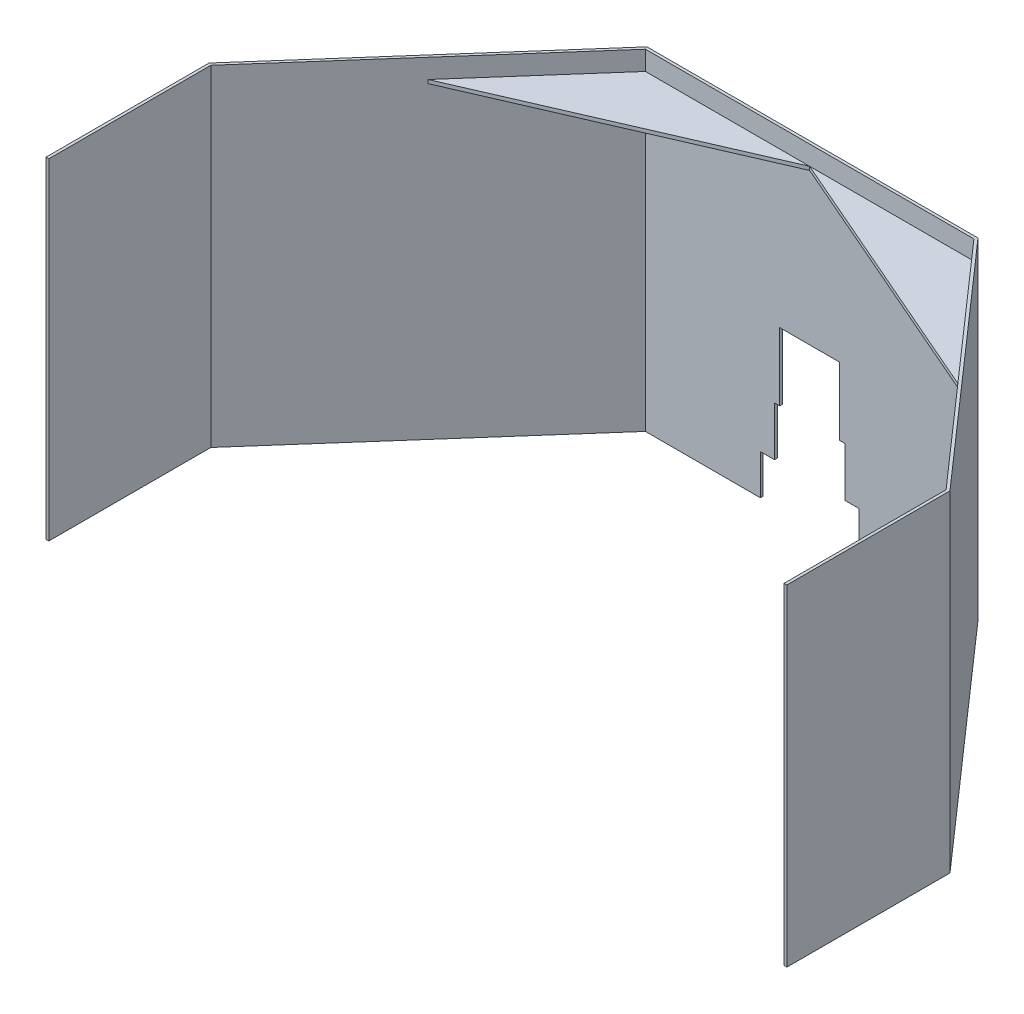
ISO-10303-21;
HEADER;
FILE_DESCRIPTION(('STEP AP214'),'2;1');
FILE_NAME('part.step','',(''),(''),'','','');
FILE_SCHEMA(('AUTOMOTIVE_DESIGN { 1 0 10303 214 1 1 1 1 }'));
ENDSEC;
DATA;
#1=APPLICATION_CONTEXT('core data for automotive mechanical design processes');
#2=APPLICATION_PROTOCOL_DEFINITION('international standard','automotive_design',2000,#1);
#3=PRODUCT_CONTEXT('',#1,'mechanical');
#4=PRODUCT('Part','Part','',(#3));
#5=PRODUCT_RELATED_PRODUCT_CATEGORY('part','',(#4));
#6=PRODUCT_DEFINITION_FORMATION('','',#4);
#7=PRODUCT_DEFINITION_CONTEXT('part definition',#1,'design');
#8=PRODUCT_DEFINITION('design','',#6,#7);
#9=PRODUCT_DEFINITION_SHAPE('','',#8);
#10=(LENGTH_UNIT() NAMED_UNIT(*) SI_UNIT(.MILLI.,.METRE.));
#11=(NAMED_UNIT(*) PLANE_ANGLE_UNIT() SI_UNIT($,.RADIAN.));
#12=(NAMED_UNIT(*) SI_UNIT($,.STERADIAN.) SOLID_ANGLE_UNIT());
#13=UNCERTAINTY_MEASURE_WITH_UNIT(LENGTH_MEASURE(1.E-05),#10,'distance_accuracy_value','');
#14=(GEOMETRIC_REPRESENTATION_CONTEXT(3) GLOBAL_UNCERTAINTY_ASSIGNED_CONTEXT((#13)) GLOBAL_UNIT_ASSIGNED_CONTEXT((#10,
#11,#12)) REPRESENTATION_CONTEXT('',''));
#15=CARTESIAN_POINT('',(0.,0.,0.));
#16=DIRECTION('',(0.,0.,1.));
#17=DIRECTION('',(1.,0.,0.));
#18=AXIS2_PLACEMENT_3D('',#15,#16,#17);
#19=CARTESIAN_POINT('',(-116.600094821892,234.9999999,-324.155640398222));
#20=DIRECTION('',(0.,0.,-1.));
#21=DIRECTION('',(-1.,0.,0.));
#22=AXIS2_PLACEMENT_3D('',#19,#20,#21);
#23=PLANE('',#22);
#24=DIRECTION('',(1.,0.,0.));
#25=VECTOR('',#24,1.);
#26=CARTESIAN_POINT('',(-116.600094821892,218.763200139835,-324.155640398222));
#27=LINE('',#26,#25);
#28=CARTESIAN_POINT('',(-116.600094821892,218.763200139835,-324.155640398222));
#29=VERTEX_POINT('',#28);
#30=CARTESIAN_POINT('',(-1.66533453693773E-13,218.763200139835,-324.155640398222));
#31=VERTEX_POINT('',#30);
#32=EDGE_CURVE('E37',#29,#31,#27,.T.);
#33=ORIENTED_EDGE('',*,*,#32,.F.);
#34=DIRECTION('',(0.,-1.,0.));
#35=VECTOR('',#34,1.);
#36=CARTESIAN_POINT('',(-116.600094821892,234.9999999,-324.155640398222));
#37=LINE('',#36,#35);
#38=CARTESIAN_POINT('',(-116.600094821892,0.,-324.155640398222));
#39=VERTEX_POINT('',#38);
#40=EDGE_CURVE('E420',#29,#39,#37,.T.);
#41=ORIENTED_EDGE('',*,*,#40,.T.);
#42=DIRECTION('',(1.,0.,0.));
#43=VECTOR('',#42,1.);
#44=CARTESIAN_POINT('',(-116.600094821892,0.,-324.155640398222));
#45=LINE('',#44,#43);
#46=CARTESIAN_POINT('',(-35.0000000000001,0.,-324.155640398222));
#47=VERTEX_POINT('',#46);
#48=EDGE_CURVE('E361',#39,#47,#45,.T.);
#49=ORIENTED_EDGE('',*,*,#48,.T.);
#50=DIRECTION('',(0.,1.,0.));
#51=VECTOR('',#50,1.);
#52=CARTESIAN_POINT('',(-35.,0.,-324.155640398222));
#53=LINE('',#52,#51);
#54=CARTESIAN_POINT('',(-35.,28.4,-324.155640398222));
#55=VERTEX_POINT('',#54);
#56=EDGE_CURVE('E287',#47,#55,#53,.T.);
#57=ORIENTED_EDGE('',*,*,#56,.T.);
#58=DIRECTION('',(1.,0.,0.));
#59=VECTOR('',#58,1.);
#60=CARTESIAN_POINT('',(0.,28.4,-324.155640398222));
#61=LINE('',#60,#59);
#62=CARTESIAN_POINT('',(-25.0000000000001,28.4,-324.155640398222));
#63=VERTEX_POINT('',#62);
#64=EDGE_CURVE('E290',#55,#63,#61,.T.);
#65=ORIENTED_EDGE('',*,*,#64,.T.);
#66=DIRECTION('',(0.,1.,0.));
#67=VECTOR('',#66,1.);
#68=CARTESIAN_POINT('',(-25.0000000000001,0.,-324.155640398222));
#69=LINE('',#68,#67);
#70=CARTESIAN_POINT('',(-25.0000000000001,63.399999946,-324.155640398222));
#71=VERTEX_POINT('',#70);
#72=EDGE_CURVE('E293',#63,#71,#69,.T.);
#73=ORIENTED_EDGE('',*,*,#72,.T.);
#74=DIRECTION('',(1.,0.,0.));
#75=VECTOR('',#74,1.);
#76=CARTESIAN_POINT('',(0.,63.399999946,-324.155640398222));
#77=LINE('',#76,#75);
#78=CARTESIAN_POINT('',(-21.25,63.399999946,-324.155640398222));
#79=VERTEX_POINT('',#78);
#80=EDGE_CURVE('E296',#71,#79,#77,.T.);
#81=ORIENTED_EDGE('',*,*,#80,.T.);
#82=DIRECTION('',(0.,1.,0.));
#83=VECTOR('',#82,1.);
#84=CARTESIAN_POINT('',(-21.2500000000001,0.,-324.155640398222));
#85=LINE('',#84,#83);
#86=CARTESIAN_POINT('',(-21.2500000000001,111.499999916,-324.155640398222));
#87=VERTEX_POINT('',#86);
#88=EDGE_CURVE('E299',#79,#87,#85,.T.);
#89=ORIENTED_EDGE('',*,*,#88,.T.);
#90=DIRECTION('',(1.,0.,0.));
#91=VECTOR('',#90,1.);
#92=CARTESIAN_POINT('',(0.,111.499999916,-324.155640398222));
#93=LINE('',#92,#91);
#94=CARTESIAN_POINT('',(21.2499999999999,111.499999916,-324.155640398222));
#95=VERTEX_POINT('',#94);
#96=EDGE_CURVE('E277',#87,#95,#93,.T.);
#97=ORIENTED_EDGE('',*,*,#96,.T.);
#98=DIRECTION('',(0.,1.,0.));
#99=VECTOR('',#98,1.);
#100=CARTESIAN_POINT('',(21.2499999999999,0.,-324.155640398222));
#101=LINE('',#100,#99);
#102=CARTESIAN_POINT('',(21.2499999999999,63.399999946,-324.155640398222));
#103=VERTEX_POINT('',#102);
#104=EDGE_CURVE('E274',#103,#95,#101,.T.);
#105=ORIENTED_EDGE('',*,*,#104,.F.);
#106=DIRECTION('',(1.,0.,0.));
#107=VECTOR('',#106,1.);
#108=CARTESIAN_POINT('',(0.,63.399999946,-324.155640398222));
#109=LINE('',#108,#107);
#110=CARTESIAN_POINT('',(25.,63.399999946,-324.155640398222));
#111=VERTEX_POINT('',#110);
#112=EDGE_CURVE('E276',#103,#111,#109,.T.);
#113=ORIENTED_EDGE('',*,*,#112,.T.);
#114=DIRECTION('',(0.,1.,0.));
#115=VECTOR('',#114,1.);
#116=CARTESIAN_POINT('',(24.9999999999999,0.,-324.155640398222));
#117=LINE('',#116,#115);
#118=CARTESIAN_POINT('',(24.9999999999999,28.4,-324.155640398222));
#119=VERTEX_POINT('',#118);
#120=EDGE_CURVE('E280',#119,#111,#117,.T.);
#121=ORIENTED_EDGE('',*,*,#120,.F.);
#122=DIRECTION('',(1.,0.,0.));
#123=VECTOR('',#122,1.);
#124=CARTESIAN_POINT('',(0.,28.4,-324.155640398222));
#125=LINE('',#124,#123);
#126=CARTESIAN_POINT('',(35.,28.4,-324.155640398222));
#127=VERTEX_POINT('',#126);
#128=EDGE_CURVE('E282',#119,#127,#125,.T.);
#129=ORIENTED_EDGE('',*,*,#128,.T.);
#130=DIRECTION('',(0.,1.,0.));
#131=VECTOR('',#130,1.);
#132=CARTESIAN_POINT('',(35.,0.,-324.155640398222));
#133=LINE('',#132,#131);
#134=CARTESIAN_POINT('',(35.,0.,-324.155640398222));
#135=VERTEX_POINT('',#134);
#136=EDGE_CURVE('E285',#135,#127,#133,.T.);
#137=ORIENTED_EDGE('',*,*,#136,.F.);
#138=CARTESIAN_POINT('',(116.600094821898,0.,-324.155640398222));
#139=VERTEX_POINT('',#138);
#140=EDGE_CURVE('E415',#135,#139,#45,.T.);
#141=ORIENTED_EDGE('',*,*,#140,.T.);
#142=DIRECTION('',(0.,-1.,0.));
#143=VECTOR('',#142,1.);
#144=CARTESIAN_POINT('',(116.600094821898,234.9999999,-324.155640398222));
#145=LINE('',#144,#143);
#146=CARTESIAN_POINT('',(116.600094821898,218.763200139835,-324.155640398222));
#147=VERTEX_POINT('',#146);
#148=EDGE_CURVE('E386',#147,#139,#145,.T.);
#149=ORIENTED_EDGE('',*,*,#148,.F.);
#150=DIRECTION('',(1.,0.,0.));
#151=VECTOR('',#150,1.);
#152=CARTESIAN_POINT('',(-116.600094821892,218.763200139835,-324.155640398222));
#153=LINE('',#152,#151);
#154=EDGE_CURVE('E258',#31,#147,#153,.T.);
#155=ORIENTED_EDGE('',*,*,#154,.F.);
#156=EDGE_LOOP('',(#33,#41,#49,#57,#65,#73,#81,#89,#97,#105,#113,#121,#129,#137,#141,#149,#155));
#157=FACE_BOUND('',#156,.T.);
#158=ADVANCED_FACE('F33',(#157),#23,.F.);
#159=CARTESIAN_POINT('',(0.,0.,0.));
#160=DIRECTION('',(0.,-1.,0.));
#161=DIRECTION('',(0.,0.,-1.));
#162=AXIS2_PLACEMENT_3D('',#159,#160,#161);
#163=PLANE('',#162);
#164=DIRECTION('',(1.,0.,0.));
#165=VECTOR('',#164,1.);
#166=CARTESIAN_POINT('',(-117.504462868261,0.,-326.155640462222));
#167=LINE('',#166,#165);
#168=CARTESIAN_POINT('',(-117.504462868261,0.,-326.155640462222));
#169=VERTEX_POINT('',#168);
#170=CARTESIAN_POINT('',(-35.0000000000001,0.,-326.155640462222));
#171=VERTEX_POINT('',#170);
#172=EDGE_CURVE('E399',#169,#171,#167,.T.);
#173=ORIENTED_EDGE('',*,*,#172,.T.);
#174=DIRECTION('',(0.,0.,-1.));
#175=VECTOR('',#174,1.);
#176=CARTESIAN_POINT('',(-35.,0.,-192.503637066453));
#177=LINE('',#176,#175);
#178=EDGE_CURVE('E338',#47,#171,#177,.T.);
#179=ORIENTED_EDGE('',*,*,#178,.F.);
#180=ORIENTED_EDGE('',*,*,#48,.F.);
#181=DIRECTION('',(-0.660480799666582,0.,0.750842935154745));
#182=VECTOR('',#181,1.);
#183=CARTESIAN_POINT('',(-116.600094821892,0.,-324.155640398222));
#184=LINE('',#183,#182);
#185=CARTESIAN_POINT('',(-261.,0.,-159.999999999999));
#186=VERTEX_POINT('',#185);
#187=EDGE_CURVE('E412',#39,#186,#184,.T.);
#188=ORIENTED_EDGE('',*,*,#187,.T.);
#189=DIRECTION('',(0.,0.,1.));
#190=VECTOR('',#189,1.);
#191=CARTESIAN_POINT('',(-261.,0.,-159.999999999999));
#192=LINE('',#191,#190);
#193=CARTESIAN_POINT('',(-261.,0.,-45.0012142751788));
#194=VERTEX_POINT('',#193);
#195=EDGE_CURVE('E409',#186,#194,#192,.T.);
#196=ORIENTED_EDGE('',*,*,#195,.T.);
#197=DIRECTION('',(1.,0.,9.02056178642204E-13));
#198=VECTOR('',#197,1.);
#199=CARTESIAN_POINT('',(-263.000000064,0.,-45.0012142751806));
#200=LINE('',#199,#198);
#201=CARTESIAN_POINT('',(-263.000000064,0.,-45.0012142751806));
#202=VERTEX_POINT('',#201);
#203=EDGE_CURVE('E406',#202,#194,#200,.T.);
#204=ORIENTED_EDGE('',*,*,#203,.F.);
#205=DIRECTION('',(0.,0.,1.));
#206=VECTOR('',#205,1.);
#207=CARTESIAN_POINT('',(-263.000000064,0.,-160.75447171498));
#208=LINE('',#207,#206);
#209=CARTESIAN_POINT('',(-263.000000064,0.,-160.75447171498));
#210=VERTEX_POINT('',#209);
#211=EDGE_CURVE('E404',#210,#202,#208,.T.);
#212=ORIENTED_EDGE('',*,*,#211,.F.);
#213=DIRECTION('',(-0.660480799666582,0.,0.750842935154745));
#214=VECTOR('',#213,1.);
#215=CARTESIAN_POINT('',(-117.504462868261,0.,-326.155640462222));
#216=LINE('',#215,#214);
#217=EDGE_CURVE('E402',#169,#210,#216,.T.);
#218=ORIENTED_EDGE('',*,*,#217,.F.);
#219=EDGE_LOOP('',(#173,#179,#180,#188,#196,#204,#212,#218));
#220=FACE_BOUND('',#219,.T.);
#221=ADVANCED_FACE('F474',(#220),#163,.T.);
#222=CARTESIAN_POINT('',(116.600094821898,234.9999999,-324.155640398222));
#223=DIRECTION('',(0.750842935154446,0.,-0.660480799666921));
#224=DIRECTION('',(-0.660480799666921,0.,-0.750842935154446));
#225=AXIS2_PLACEMENT_3D('',#222,#223,#224);
#226=PLANE('',#225);
#227=CARTESIAN_POINT('',(116.600094821898,234.9999999,-324.155640398222));
#228=VERTEX_POINT('',#227);
#229=CARTESIAN_POINT('',(116.600094821898,221.303200139835,-324.155640398222));
#230=VERTEX_POINT('',#229);
#231=EDGE_CURVE('E418',#228,#230,#145,.T.);
#232=ORIENTED_EDGE('',*,*,#231,.T.);
#233=DIRECTION('',(0.660480799666921,0.,0.750842935154446));
#234=VECTOR('',#233,1.);
#235=CARTESIAN_POINT('',(116.600094821898,221.303200139835,-324.155640398222));
#236=LINE('',#235,#234);
#237=CARTESIAN_POINT('',(188.800047410949,221.303200139835,-242.077820199189));
#238=VERTEX_POINT('',#237);
#239=EDGE_CURVE('E239',#230,#238,#236,.T.);
#240=ORIENTED_EDGE('',*,*,#239,.T.);
#241=DIRECTION('',(0.,-1.,0.));
#242=VECTOR('',#241,1.);
#243=CARTESIAN_POINT('',(188.800047410949,234.9999999,-242.077820199189));
#244=LINE('',#243,#242);
#245=CARTESIAN_POINT('',(188.800047410949,218.763200139835,-242.077820199189));
#246=VERTEX_POINT('',#245);
#247=EDGE_CURVE('E231',#238,#246,#244,.T.);
#248=ORIENTED_EDGE('',*,*,#247,.T.);
#249=DIRECTION('',(0.660480799666921,0.,0.750842935154446));
#250=VECTOR('',#249,1.);
#251=CARTESIAN_POINT('',(116.600094821898,218.763200139835,-324.155640398222));
#252=LINE('',#251,#250);
#253=EDGE_CURVE('E234',#147,#246,#252,.T.);
#254=ORIENTED_EDGE('',*,*,#253,.F.);
#255=ORIENTED_EDGE('',*,*,#148,.T.);
#256=DIRECTION('',(0.660480799666921,0.,0.750842935154446));
#257=VECTOR('',#256,1.);
#258=CARTESIAN_POINT('',(116.600094821898,0.,-324.155640398222));
#259=LINE('',#258,#257);
#260=CARTESIAN_POINT('',(261.,0.,-160.000000000156));
#261=VERTEX_POINT('',#260);
#262=EDGE_CURVE('E302',#139,#261,#259,.T.);
#263=ORIENTED_EDGE('',*,*,#262,.T.);
#264=DIRECTION('',(0.,-1.,0.));
#265=VECTOR('',#264,1.);
#266=CARTESIAN_POINT('',(261.,234.9999999,-160.000000000156));
#267=LINE('',#266,#265);
#268=CARTESIAN_POINT('',(261.,234.9999999,-160.000000000156));
#269=VERTEX_POINT('',#268);
#270=EDGE_CURVE('E445',#269,#261,#267,.T.);
#271=ORIENTED_EDGE('',*,*,#270,.F.);
#272=DIRECTION('',(0.660480799666921,0.,0.750842935154446));
#273=VECTOR('',#272,1.);
#274=CARTESIAN_POINT('',(116.600094821898,234.9999999,-324.155640398222));
#275=LINE('',#274,#273);
#276=EDGE_CURVE('E357',#228,#269,#275,.T.);
#277=ORIENTED_EDGE('',*,*,#276,.F.);
#278=EDGE_LOOP('',(#232,#240,#248,#254,#255,#263,#271,#277));
#279=FACE_BOUND('',#278,.T.);
#280=ADVANCED_FACE('F35',(#279),#226,.F.);
#281=CARTESIAN_POINT('',(261.,234.9999999,-160.000000000156));
#282=DIRECTION('',(1.,0.,0.));
#283=DIRECTION('',(0.,0.,-1.));
#284=AXIS2_PLACEMENT_3D('',#281,#282,#283);
#285=PLANE('',#284);
#286=DIRECTION('',(0.,0.,1.));
#287=VECTOR('',#286,1.);
#288=CARTESIAN_POINT('',(261.,0.,-160.000000000156));
#289=LINE('',#288,#287);
#290=CARTESIAN_POINT('',(261.,0.,-45.0034531183566));
#291=VERTEX_POINT('',#290);
#292=EDGE_CURVE('E389',#261,#291,#289,.T.);
#293=ORIENTED_EDGE('',*,*,#292,.T.);
#294=DIRECTION('',(0.,-1.,0.));
#295=VECTOR('',#294,1.);
#296=CARTESIAN_POINT('',(261.,234.9999999,-45.0034531183566));
#297=LINE('',#296,#295);
#298=CARTESIAN_POINT('',(261.,234.9999999,-45.0034531183566));
#299=VERTEX_POINT('',#298);
#300=EDGE_CURVE('E442',#299,#291,#297,.T.);
#301=ORIENTED_EDGE('',*,*,#300,.F.);
#302=DIRECTION('',(0.,0.,1.));
#303=VECTOR('',#302,1.);
#304=CARTESIAN_POINT('',(261.,234.9999999,-160.000000000156));
#305=LINE('',#304,#303);
#306=EDGE_CURVE('E360',#269,#299,#305,.T.);
#307=ORIENTED_EDGE('',*,*,#306,.F.);
#308=ORIENTED_EDGE('',*,*,#270,.T.);
#309=EDGE_LOOP('',(#293,#301,#307,#308));
#310=FACE_BOUND('',#309,.T.);
#311=ADVANCED_FACE('F530',(#310),#285,.F.);
#312=CARTESIAN_POINT('',(261.,234.9999999,-45.0034531183566));
#313=DIRECTION('',(0.,0.,-1.));
#314=DIRECTION('',(-1.,0.,0.));
#315=AXIS2_PLACEMENT_3D('',#312,#313,#314);
#316=PLANE('',#315);
#317=DIRECTION('',(1.,0.,0.));
#318=VECTOR('',#317,1.);
#319=CARTESIAN_POINT('',(261.,0.,-45.0034531183566));
#320=LINE('',#319,#318);
#321=CARTESIAN_POINT('',(263.000000064,0.,-45.0034531183566));
#322=VERTEX_POINT('',#321);
#323=EDGE_CURVE('E391',#291,#322,#320,.T.);
#324=ORIENTED_EDGE('',*,*,#323,.T.);
#325=DIRECTION('',(0.,-1.,0.));
#326=VECTOR('',#325,1.);
#327=CARTESIAN_POINT('',(263.000000064,234.9999999,-45.0034531183566));
#328=LINE('',#327,#326);
#329=CARTESIAN_POINT('',(263.000000064,234.9999999,-45.0034531183566));
#330=VERTEX_POINT('',#329);
#331=EDGE_CURVE('E439',#330,#322,#328,.T.);
#332=ORIENTED_EDGE('',*,*,#331,.F.);
#333=DIRECTION('',(1.,0.,0.));
#334=VECTOR('',#333,1.);
#335=CARTESIAN_POINT('',(261.,234.9999999,-45.0034531183566));
#336=LINE('',#335,#334);
#337=EDGE_CURVE('E363',#299,#330,#336,.T.);
#338=ORIENTED_EDGE('',*,*,#337,.F.);
#339=ORIENTED_EDGE('',*,*,#300,.T.);
#340=EDGE_LOOP('',(#324,#332,#338,#339));
#341=FACE_BOUND('',#340,.T.);
#342=ADVANCED_FACE('F527',(#341),#316,.F.);
#343=CARTESIAN_POINT('',(263.000000064,234.9999999,-45.0034531183566));
#344=DIRECTION('',(-1.,0.,0.));
#345=DIRECTION('',(0.,0.,1.));
#346=AXIS2_PLACEMENT_3D('',#343,#344,#345);
#347=PLANE('',#346);
#348=DIRECTION('',(0.,0.,-1.));
#349=VECTOR('',#348,1.);
#350=CARTESIAN_POINT('',(263.000000064,0.,-45.0034531183566));
#351=LINE('',#350,#349);
#352=CARTESIAN_POINT('',(263.000000064,0.,-160.754471714977));
#353=VERTEX_POINT('',#352);
#354=EDGE_CURVE('E393',#322,#353,#351,.T.);
#355=ORIENTED_EDGE('',*,*,#354,.T.);
#356=DIRECTION('',(0.,-1.,0.));
#357=VECTOR('',#356,1.);
#358=CARTESIAN_POINT('',(263.000000064,234.9999999,-160.754471714977));
#359=LINE('',#358,#357);
#360=CARTESIAN_POINT('',(263.000000064,234.9999999,-160.754471714977));
#361=VERTEX_POINT('',#360);
#362=EDGE_CURVE('E436',#361,#353,#359,.T.);
#363=ORIENTED_EDGE('',*,*,#362,.F.);
#364=DIRECTION('',(0.,0.,-1.));
#365=VECTOR('',#364,1.);
#366=CARTESIAN_POINT('',(263.000000064,234.9999999,-45.0034531183566));
#367=LINE('',#366,#365);
#368=EDGE_CURVE('E365',#330,#361,#367,.T.);
#369=ORIENTED_EDGE('',*,*,#368,.F.);
#370=ORIENTED_EDGE('',*,*,#331,.T.);
#371=EDGE_LOOP('',(#355,#363,#369,#370));
#372=FACE_BOUND('',#371,.T.);
#373=ADVANCED_FACE('F523',(#372),#347,.F.);
#374=CARTESIAN_POINT('',(263.000000064,234.9999999,-160.754471714977));
#375=DIRECTION('',(-0.750842935154767,0.,0.660480799666557));
#376=DIRECTION('',(0.660480799666557,0.,0.750842935154767));
#377=AXIS2_PLACEMENT_3D('',#374,#375,#376);
#378=PLANE('',#377);
#379=DIRECTION('',(-0.660480799666557,0.,-0.750842935154767));
#380=VECTOR('',#379,1.);
#381=CARTESIAN_POINT('',(263.000000064,0.,-160.754471714977));
#382=LINE('',#381,#380);
#383=CARTESIAN_POINT('',(117.504462868267,0.,-326.155640462222));
#384=VERTEX_POINT('',#383);
#385=EDGE_CURVE('E395',#353,#384,#382,.T.);
#386=ORIENTED_EDGE('',*,*,#385,.T.);
#387=DIRECTION('',(0.,-1.,0.));
#388=VECTOR('',#387,1.);
#389=CARTESIAN_POINT('',(117.504462868267,234.9999999,-326.155640462222));
#390=LINE('',#389,#388);
#391=CARTESIAN_POINT('',(117.504462868267,234.9999999,-326.155640462222));
#392=VERTEX_POINT('',#391);
#393=EDGE_CURVE('E434',#392,#384,#390,.T.);
#394=ORIENTED_EDGE('',*,*,#393,.F.);
#395=DIRECTION('',(-0.660480799666557,0.,-0.750842935154767));
#396=VECTOR('',#395,1.);
#397=CARTESIAN_POINT('',(263.000000064,234.9999999,-160.754471714977));
#398=LINE('',#397,#396);
#399=EDGE_CURVE('E367',#361,#392,#398,.T.);
#400=ORIENTED_EDGE('',*,*,#399,.F.);
#401=ORIENTED_EDGE('',*,*,#362,.T.);
#402=EDGE_LOOP('',(#386,#394,#400,#401));
#403=FACE_BOUND('',#402,.T.);
#404=ADVANCED_FACE('F519',(#403),#378,.F.);
#405=CARTESIAN_POINT('',(-117.504462868261,234.9999999,-326.155640462222));
#406=DIRECTION('',(0.,0.,-1.));
#407=DIRECTION('',(-1.,0.,0.));
#408=AXIS2_PLACEMENT_3D('',#405,#406,#407);
#409=PLANE('',#408);
#410=ORIENTED_EDGE('',*,*,#172,.F.);
#411=DIRECTION('',(0.,-1.,0.));
#412=VECTOR('',#411,1.);
#413=CARTESIAN_POINT('',(-117.504462868261,234.9999999,-326.155640462222));
#414=LINE('',#413,#412);
#415=CARTESIAN_POINT('',(-117.504462868261,234.9999999,-326.155640462222));
#416=VERTEX_POINT('',#415);
#417=EDGE_CURVE('E432',#416,#169,#414,.T.);
#418=ORIENTED_EDGE('',*,*,#417,.F.);
#419=DIRECTION('',(1.,0.,0.));
#420=VECTOR('',#419,1.);
#421=CARTESIAN_POINT('',(-117.504462868261,234.9999999,-326.155640462222));
#422=LINE('',#421,#420);
#423=EDGE_CURVE('E369',#416,#392,#422,.T.);
#424=ORIENTED_EDGE('',*,*,#423,.T.);
#425=ORIENTED_EDGE('',*,*,#393,.T.);
#426=CARTESIAN_POINT('',(35.,0.,-326.155640462222));
#427=VERTEX_POINT('',#426);
#428=EDGE_CURVE('E398',#427,#384,#167,.T.);
#429=ORIENTED_EDGE('',*,*,#428,.F.);
#430=DIRECTION('',(0.,-1.,0.));
#431=VECTOR('',#430,1.);
#432=CARTESIAN_POINT('',(35.,0.,-326.155640462222));
#433=LINE('',#432,#431);
#434=CARTESIAN_POINT('',(35.,28.4,-326.155640462222));
#435=VERTEX_POINT('',#434);
#436=EDGE_CURVE('E321',#435,#427,#433,.T.);
#437=ORIENTED_EDGE('',*,*,#436,.F.);
#438=DIRECTION('',(-1.,0.,0.));
#439=VECTOR('',#438,1.);
#440=CARTESIAN_POINT('',(0.,28.4,-326.155640462222));
#441=LINE('',#440,#439);
#442=CARTESIAN_POINT('',(24.9999999999999,28.4,-326.155640462222));
#443=VERTEX_POINT('',#442);
#444=EDGE_CURVE('E318',#435,#443,#441,.T.);
#445=ORIENTED_EDGE('',*,*,#444,.T.);
#446=DIRECTION('',(0.,-1.,0.));
#447=VECTOR('',#446,1.);
#448=CARTESIAN_POINT('',(24.9999999999999,0.,-326.155640462222));
#449=LINE('',#448,#447);
#450=CARTESIAN_POINT('',(24.9999999999999,63.399999946,-326.155640462222));
#451=VERTEX_POINT('',#450);
#452=EDGE_CURVE('E314',#451,#443,#449,.T.);
#453=ORIENTED_EDGE('',*,*,#452,.F.);
#454=DIRECTION('',(-1.,0.,0.));
#455=VECTOR('',#454,1.);
#456=CARTESIAN_POINT('',(0.,63.399999946,-326.155640462222));
#457=LINE('',#456,#455);
#458=CARTESIAN_POINT('',(21.2499999999999,63.399999946,-326.155640462222));
#459=VERTEX_POINT('',#458);
#460=EDGE_CURVE('E311',#451,#459,#457,.T.);
#461=ORIENTED_EDGE('',*,*,#460,.T.);
#462=DIRECTION('',(0.,-1.,0.));
#463=VECTOR('',#462,1.);
#464=CARTESIAN_POINT('',(21.2499999999999,0.,-326.155640462222));
#465=LINE('',#464,#463);
#466=CARTESIAN_POINT('',(21.2499999999999,111.499999916,-326.155640462222));
#467=VERTEX_POINT('',#466);
#468=EDGE_CURVE('E308',#467,#459,#465,.T.);
#469=ORIENTED_EDGE('',*,*,#468,.F.);
#470=DIRECTION('',(-1.,0.,0.));
#471=VECTOR('',#470,1.);
#472=CARTESIAN_POINT('',(-1.0640890797438E-13,111.499999916,-326.155640462222));
#473=LINE('',#472,#471);
#474=CARTESIAN_POINT('',(-21.2500000000001,111.499999916,-326.155640462222));
#475=VERTEX_POINT('',#474);
#476=EDGE_CURVE('E305',#467,#475,#473,.T.);
#477=ORIENTED_EDGE('',*,*,#476,.T.);
#478=DIRECTION('',(0.,-1.,0.));
#479=VECTOR('',#478,1.);
#480=CARTESIAN_POINT('',(-21.2500000000001,0.,-326.155640462222));
#481=LINE('',#480,#479);
#482=CARTESIAN_POINT('',(-21.2500000000001,63.399999946,-326.155640462222));
#483=VERTEX_POINT('',#482);
#484=EDGE_CURVE('E273',#475,#483,#481,.T.);
#485=ORIENTED_EDGE('',*,*,#484,.T.);
#486=CARTESIAN_POINT('',(-25.0000000000001,63.399999946,-326.155640462222));
#487=VERTEX_POINT('',#486);
#488=EDGE_CURVE('E315',#483,#487,#457,.T.);
#489=ORIENTED_EDGE('',*,*,#488,.T.);
#490=DIRECTION('',(0.,-1.,0.));
#491=VECTOR('',#490,1.);
#492=CARTESIAN_POINT('',(-25.0000000000001,0.,-326.155640462222));
#493=LINE('',#492,#491);
#494=CARTESIAN_POINT('',(-25.0000000000001,28.4,-326.155640462222));
#495=VERTEX_POINT('',#494);
#496=EDGE_CURVE('E327',#487,#495,#493,.T.);
#497=ORIENTED_EDGE('',*,*,#496,.T.);
#498=CARTESIAN_POINT('',(-35.,28.4,-326.155640462222));
#499=VERTEX_POINT('',#498);
#500=EDGE_CURVE('E322',#495,#499,#441,.T.);
#501=ORIENTED_EDGE('',*,*,#500,.T.);
#502=DIRECTION('',(0.,-1.,0.));
#503=VECTOR('',#502,1.);
#504=CARTESIAN_POINT('',(-35.0000000000001,0.,-326.155640462222));
#505=LINE('',#504,#503);
#506=EDGE_CURVE('E324',#499,#171,#505,.T.);
#507=ORIENTED_EDGE('',*,*,#506,.T.);
#508=EDGE_LOOP('',(#410,#418,#424,#425,#429,#437,#445,#453,#461,#469,#477,#485,#489,#497,#501,#507));
#509=FACE_BOUND('',#508,.T.);
#510=ADVANCED_FACE('F515',(#509),#409,.T.);
#511=CARTESIAN_POINT('',(-117.504462868261,234.9999999,-326.155640462222));
#512=DIRECTION('',(0.750842935154745,0.,0.660480799666582));
#513=DIRECTION('',(0.660480799666582,0.,-0.750842935154745));
#514=AXIS2_PLACEMENT_3D('',#511,#512,#513);
#515=PLANE('',#514);
#516=ORIENTED_EDGE('',*,*,#417,.T.);
#517=ORIENTED_EDGE('',*,*,#217,.T.);
#518=DIRECTION('',(0.,-1.,0.));
#519=VECTOR('',#518,1.);
#520=CARTESIAN_POINT('',(-263.000000064,234.9999999,-160.75447171498));
#521=LINE('',#520,#519);
#522=CARTESIAN_POINT('',(-263.000000064,234.9999999,-160.75447171498));
#523=VERTEX_POINT('',#522);
#524=EDGE_CURVE('E429',#523,#210,#521,.T.);
#525=ORIENTED_EDGE('',*,*,#524,.F.);
#526=DIRECTION('',(-0.660480799666582,0.,0.750842935154745));
#527=VECTOR('',#526,1.);
#528=CARTESIAN_POINT('',(-117.504462868261,234.9999999,-326.155640462222));
#529=LINE('',#528,#527);
#530=EDGE_CURVE('E372',#416,#523,#529,.T.);
#531=ORIENTED_EDGE('',*,*,#530,.F.);
#532=EDGE_LOOP('',(#516,#517,#525,#531));
#533=FACE_BOUND('',#532,.T.);
#534=ADVANCED_FACE('F511',(#533),#515,.F.);
#535=CARTESIAN_POINT('',(-263.000000064,234.9999999,-160.75447171498));
#536=DIRECTION('',(1.,0.,0.));
#537=DIRECTION('',(0.,0.,-1.));
#538=AXIS2_PLACEMENT_3D('',#535,#536,#537);
#539=PLANE('',#538);
#540=ORIENTED_EDGE('',*,*,#211,.T.);
#541=DIRECTION('',(0.,-1.,0.));
#542=VECTOR('',#541,1.);
#543=CARTESIAN_POINT('',(-263.000000064,234.9999999,-45.0012142751806));
#544=LINE('',#543,#542);
#545=CARTESIAN_POINT('',(-263.000000064,234.9999999,-45.0012142751806));
#546=VERTEX_POINT('',#545);
#547=EDGE_CURVE('E426',#546,#202,#544,.T.);
#548=ORIENTED_EDGE('',*,*,#547,.F.);
#549=DIRECTION('',(0.,0.,1.));
#550=VECTOR('',#549,1.);
#551=CARTESIAN_POINT('',(-263.000000064,234.9999999,-160.75447171498));
#552=LINE('',#551,#550);
#553=EDGE_CURVE('E374',#523,#546,#552,.T.);
#554=ORIENTED_EDGE('',*,*,#553,.F.);
#555=ORIENTED_EDGE('',*,*,#524,.T.);
#556=EDGE_LOOP('',(#540,#548,#554,#555));
#557=FACE_BOUND('',#556,.T.);
#558=ADVANCED_FACE('F507',(#557),#539,.F.);
#559=CARTESIAN_POINT('',(-263.000000064,234.9999999,-45.0012142751806));
#560=DIRECTION('',(9.02056178642204E-13,0.,-1.));
#561=DIRECTION('',(-1.,0.,-9.02056178642204E-13));
#562=AXIS2_PLACEMENT_3D('',#559,#560,#561);
#563=PLANE('',#562);
#564=ORIENTED_EDGE('',*,*,#203,.T.);
#565=DIRECTION('',(0.,-1.,0.));
#566=VECTOR('',#565,1.);
#567=CARTESIAN_POINT('',(-261.,234.9999999,-45.0012142751788));
#568=LINE('',#567,#566);
#569=CARTESIAN_POINT('',(-261.,234.9999999,-45.0012142751788));
#570=VERTEX_POINT('',#569);
#571=EDGE_CURVE('E424',#570,#194,#568,.T.);
#572=ORIENTED_EDGE('',*,*,#571,.F.);
#573=DIRECTION('',(1.,0.,9.02056178642204E-13));
#574=VECTOR('',#573,1.);
#575=CARTESIAN_POINT('',(-263.000000064,234.9999999,-45.0012142751806));
#576=LINE('',#575,#574);
#577=EDGE_CURVE('E376',#546,#570,#576,.T.);
#578=ORIENTED_EDGE('',*,*,#577,.F.);
#579=ORIENTED_EDGE('',*,*,#547,.T.);
#580=EDGE_LOOP('',(#564,#572,#578,#579));
#581=FACE_BOUND('',#580,.T.);
#582=ADVANCED_FACE('F502',(#581),#563,.F.);
#583=CARTESIAN_POINT('',(-261.,234.9999999,-159.999999999999));
#584=DIRECTION('',(1.,0.,0.));
#585=DIRECTION('',(0.,0.,-1.));
#586=AXIS2_PLACEMENT_3D('',#583,#584,#585);
#587=PLANE('',#586);
#588=ORIENTED_EDGE('',*,*,#195,.F.);
#589=DIRECTION('',(0.,-1.,0.));
#590=VECTOR('',#589,1.);
#591=CARTESIAN_POINT('',(-261.,234.9999999,-159.999999999999));
#592=LINE('',#591,#590);
#593=CARTESIAN_POINT('',(-261.,234.9999999,-159.999999999999));
#594=VERTEX_POINT('',#593);
#595=EDGE_CURVE('E422',#594,#186,#592,.T.);
#596=ORIENTED_EDGE('',*,*,#595,.F.);
#597=DIRECTION('',(0.,0.,1.));
#598=VECTOR('',#597,1.);
#599=CARTESIAN_POINT('',(-261.,234.9999999,-159.999999999999));
#600=LINE('',#599,#598);
#601=EDGE_CURVE('E378',#594,#570,#600,.T.);
#602=ORIENTED_EDGE('',*,*,#601,.T.);
#603=ORIENTED_EDGE('',*,*,#571,.T.);
#604=EDGE_LOOP('',(#588,#596,#602,#603));
#605=FACE_BOUND('',#604,.T.);
#606=ADVANCED_FACE('F469',(#605),#587,.T.);
#607=CARTESIAN_POINT('',(-116.600094821892,234.9999999,-324.155640398222));
#608=DIRECTION('',(0.750842935154745,0.,0.660480799666582));
#609=DIRECTION('',(0.660480799666582,0.,-0.750842935154745));
#610=AXIS2_PLACEMENT_3D('',#607,#608,#609);
#611=PLANE('',#610);
#612=DIRECTION('',(-0.660480799666582,0.,0.750842935154745));
#613=VECTOR('',#612,1.);
#614=CARTESIAN_POINT('',(-116.600094821892,221.303200139835,-324.155640398222));
#615=LINE('',#614,#613);
#616=CARTESIAN_POINT('',(-116.600094821892,221.303200139835,-324.155640398222));
#617=VERTEX_POINT('',#616);
#618=CARTESIAN_POINT('',(-188.800047410945,221.303200139835,-242.077820199111));
#619=VERTEX_POINT('',#618);
#620=EDGE_CURVE('E261',#617,#619,#615,.T.);
#621=ORIENTED_EDGE('',*,*,#620,.F.);
#622=CARTESIAN_POINT('',(-116.600094821892,234.9999999,-324.155640398222));
#623=VERTEX_POINT('',#622);
#624=EDGE_CURVE('E248',#623,#617,#37,.T.);
#625=ORIENTED_EDGE('',*,*,#624,.F.);
#626=DIRECTION('',(-0.660480799666582,0.,0.750842935154745));
#627=VECTOR('',#626,1.);
#628=CARTESIAN_POINT('',(-116.600094821892,234.9999999,-324.155640398222));
#629=LINE('',#628,#627);
#630=EDGE_CURVE('E381',#623,#594,#629,.T.);
#631=ORIENTED_EDGE('',*,*,#630,.T.);
#632=ORIENTED_EDGE('',*,*,#595,.T.);
#633=ORIENTED_EDGE('',*,*,#187,.F.);
#634=ORIENTED_EDGE('',*,*,#40,.F.);
#635=DIRECTION('',(-0.660480799666582,0.,0.750842935154745));
#636=VECTOR('',#635,1.);
#637=CARTESIAN_POINT('',(-116.600094821892,218.763200139835,-324.155640398222));
#638=LINE('',#637,#636);
#639=CARTESIAN_POINT('',(-188.800047410946,218.763200139835,-242.077820199111));
#640=VERTEX_POINT('',#639);
#641=EDGE_CURVE('E53',#29,#640,#638,.T.);
#642=ORIENTED_EDGE('',*,*,#641,.T.);
#643=DIRECTION('',(0.,-1.,0.));
#644=VECTOR('',#643,1.);
#645=CARTESIAN_POINT('',(-188.800047410945,234.9999999,-242.077820199111));
#646=LINE('',#645,#644);
#647=EDGE_CURVE('E48',#619,#640,#646,.T.);
#648=ORIENTED_EDGE('',*,*,#647,.F.);
#649=EDGE_LOOP('',(#621,#625,#631,#632,#633,#634,#642,#648));
#650=FACE_BOUND('',#649,.T.);
#651=ADVANCED_FACE('F465',(#650),#611,.T.);
#652=ORIENTED_EDGE('',*,*,#624,.T.);
#653=DIRECTION('',(1.,0.,0.));
#654=VECTOR('',#653,1.);
#655=CARTESIAN_POINT('',(-116.600094821892,221.303200139835,-324.155640398222));
#656=LINE('',#655,#654);
#657=CARTESIAN_POINT('',(0.,221.303200139835,-324.155640398222));
#658=VERTEX_POINT('',#657);
#659=EDGE_CURVE('E11',#617,#658,#656,.T.);
#660=ORIENTED_EDGE('',*,*,#659,.T.);
#661=DIRECTION('',(1.,0.,0.));
#662=VECTOR('',#661,1.);
#663=CARTESIAN_POINT('',(-116.600094821892,221.303200139835,-324.155640398222));
#664=LINE('',#663,#662);
#665=EDGE_CURVE('E237',#658,#230,#664,.T.);
#666=ORIENTED_EDGE('',*,*,#665,.T.);
#667=ORIENTED_EDGE('',*,*,#231,.F.);
#668=DIRECTION('',(1.,0.,0.));
#669=VECTOR('',#668,1.);
#670=CARTESIAN_POINT('',(-116.600094821892,234.9999999,-324.155640398222));
#671=LINE('',#670,#669);
#672=EDGE_CURVE('E384',#623,#228,#671,.T.);
#673=ORIENTED_EDGE('',*,*,#672,.F.);
#674=EDGE_LOOP('',(#652,#660,#666,#667,#673));
#675=FACE_BOUND('',#674,.T.);
#676=ADVANCED_FACE('F246',(#675),#23,.F.);
#677=CARTESIAN_POINT('',(0.,234.9999999,0.));
#678=DIRECTION('',(0.,-1.,0.));
#679=DIRECTION('',(0.,0.,-1.));
#680=AXIS2_PLACEMENT_3D('',#677,#678,#679);
#681=PLANE('',#680);
#682=ORIENTED_EDGE('',*,*,#276,.T.);
#683=ORIENTED_EDGE('',*,*,#306,.T.);
#684=ORIENTED_EDGE('',*,*,#337,.T.);
#685=ORIENTED_EDGE('',*,*,#368,.T.);
#686=ORIENTED_EDGE('',*,*,#399,.T.);
#687=ORIENTED_EDGE('',*,*,#423,.F.);
#688=ORIENTED_EDGE('',*,*,#530,.T.);
#689=ORIENTED_EDGE('',*,*,#553,.T.);
#690=ORIENTED_EDGE('',*,*,#577,.T.);
#691=ORIENTED_EDGE('',*,*,#601,.F.);
#692=ORIENTED_EDGE('',*,*,#630,.F.);
#693=ORIENTED_EDGE('',*,*,#672,.T.);
#694=EDGE_LOOP('',(#682,#683,#684,#685,#686,#687,#688,#689,#690,#691,#692,#693));
#695=FACE_BOUND('',#694,.T.);
#696=ADVANCED_FACE('F464',(#695),#681,.F.);
#697=DIRECTION('',(0.,0.,-1.));
#698=VECTOR('',#697,1.);
#699=CARTESIAN_POINT('',(35.,0.,-192.503637066453));
#700=LINE('',#699,#698);
#701=EDGE_CURVE('E340',#135,#427,#700,.T.);
#702=ORIENTED_EDGE('',*,*,#701,.T.);
#703=ORIENTED_EDGE('',*,*,#428,.T.);
#704=ORIENTED_EDGE('',*,*,#385,.F.);
#705=ORIENTED_EDGE('',*,*,#354,.F.);
#706=ORIENTED_EDGE('',*,*,#323,.F.);
#707=ORIENTED_EDGE('',*,*,#292,.F.);
#708=ORIENTED_EDGE('',*,*,#262,.F.);
#709=ORIENTED_EDGE('',*,*,#140,.F.);
#710=EDGE_LOOP('',(#702,#703,#704,#705,#706,#707,#708,#709));
#711=FACE_BOUND('',#710,.T.);
#712=ADVANCED_FACE('F491',(#711),#163,.T.);
#713=CARTESIAN_POINT('',(0.,111.499999916,-192.503637066453));
#714=DIRECTION('',(0.,-1.,0.));
#715=DIRECTION('',(1.,0.,0.));
#716=AXIS2_PLACEMENT_3D('',#713,#714,#715);
#717=PLANE('',#716);
#718=DIRECTION('',(0.,0.,-1.));
#719=VECTOR('',#718,1.);
#720=CARTESIAN_POINT('',(-21.25,111.499999916,-192.503637066453));
#721=LINE('',#720,#719);
#722=EDGE_CURVE('E353',#87,#475,#721,.T.);
#723=ORIENTED_EDGE('',*,*,#722,.T.);
#724=ORIENTED_EDGE('',*,*,#476,.F.);
#725=DIRECTION('',(0.,0.,-1.));
#726=VECTOR('',#725,1.);
#727=CARTESIAN_POINT('',(21.25,111.499999916,-192.503637066453));
#728=LINE('',#727,#726);
#729=EDGE_CURVE('E351',#95,#467,#728,.T.);
#730=ORIENTED_EDGE('',*,*,#729,.F.);
#731=ORIENTED_EDGE('',*,*,#96,.F.);
#732=EDGE_LOOP('',(#723,#724,#730,#731));
#733=FACE_BOUND('',#732,.T.);
#734=ADVANCED_FACE('F584',(#733),#717,.T.);
#735=CARTESIAN_POINT('',(21.2499999999999,0.,-192.503637066453));
#736=DIRECTION('',(1.,0.,0.));
#737=DIRECTION('',(0.,1.,0.));
#738=AXIS2_PLACEMENT_3D('',#735,#736,#737);
#739=PLANE('',#738);
#740=ORIENTED_EDGE('',*,*,#104,.T.);
#741=ORIENTED_EDGE('',*,*,#729,.T.);
#742=ORIENTED_EDGE('',*,*,#468,.T.);
#743=DIRECTION('',(0.,0.,-1.));
#744=VECTOR('',#743,1.);
#745=CARTESIAN_POINT('',(21.25,63.399999946,-192.503637066453));
#746=LINE('',#745,#744);
#747=EDGE_CURVE('E349',#103,#459,#746,.T.);
#748=ORIENTED_EDGE('',*,*,#747,.F.);
#749=EDGE_LOOP('',(#740,#741,#742,#748));
#750=FACE_BOUND('',#749,.T.);
#751=ADVANCED_FACE('F588',(#750),#739,.F.);
#752=CARTESIAN_POINT('',(0.,63.399999946,-192.503637066453));
#753=DIRECTION('',(0.,-1.,0.));
#754=DIRECTION('',(0.,0.,-1.));
#755=AXIS2_PLACEMENT_3D('',#752,#753,#754);
#756=PLANE('',#755);
#757=ORIENTED_EDGE('',*,*,#747,.T.);
#758=ORIENTED_EDGE('',*,*,#460,.F.);
#759=DIRECTION('',(0.,0.,-1.));
#760=VECTOR('',#759,1.);
#761=CARTESIAN_POINT('',(25.,63.399999946,-192.503637066453));
#762=LINE('',#761,#760);
#763=EDGE_CURVE('E347',#111,#451,#762,.T.);
#764=ORIENTED_EDGE('',*,*,#763,.F.);
#765=ORIENTED_EDGE('',*,*,#112,.F.);
#766=EDGE_LOOP('',(#757,#758,#764,#765));
#767=FACE_BOUND('',#766,.T.);
#768=ADVANCED_FACE('F592',(#767),#756,.T.);
#769=CARTESIAN_POINT('',(24.9999999999999,0.,-192.503637066453));
#770=DIRECTION('',(1.,0.,0.));
#771=DIRECTION('',(0.,1.,0.));
#772=AXIS2_PLACEMENT_3D('',#769,#770,#771);
#773=PLANE('',#772);
#774=ORIENTED_EDGE('',*,*,#120,.T.);
#775=ORIENTED_EDGE('',*,*,#763,.T.);
#776=ORIENTED_EDGE('',*,*,#452,.T.);
#777=DIRECTION('',(0.,0.,-1.));
#778=VECTOR('',#777,1.);
#779=CARTESIAN_POINT('',(25.,28.4,-192.503637066453));
#780=LINE('',#779,#778);
#781=EDGE_CURVE('E345',#119,#443,#780,.T.);
#782=ORIENTED_EDGE('',*,*,#781,.F.);
#783=EDGE_LOOP('',(#774,#775,#776,#782));
#784=FACE_BOUND('',#783,.T.);
#785=ADVANCED_FACE('F598',(#784),#773,.F.);
#786=CARTESIAN_POINT('',(0.,28.4,-192.503637066453));
#787=DIRECTION('',(0.,-1.,0.));
#788=DIRECTION('',(0.,0.,-1.));
#789=AXIS2_PLACEMENT_3D('',#786,#787,#788);
#790=PLANE('',#789);
#791=ORIENTED_EDGE('',*,*,#781,.T.);
#792=ORIENTED_EDGE('',*,*,#444,.F.);
#793=DIRECTION('',(0.,0.,-1.));
#794=VECTOR('',#793,1.);
#795=CARTESIAN_POINT('',(35.,28.4,-192.503637066453));
#796=LINE('',#795,#794);
#797=EDGE_CURVE('E343',#127,#435,#796,.T.);
#798=ORIENTED_EDGE('',*,*,#797,.F.);
#799=ORIENTED_EDGE('',*,*,#128,.F.);
#800=EDGE_LOOP('',(#791,#792,#798,#799));
#801=FACE_BOUND('',#800,.T.);
#802=ADVANCED_FACE('F601',(#801),#790,.T.);
#803=CARTESIAN_POINT('',(35.,0.,-192.503637066453));
#804=DIRECTION('',(1.,0.,0.));
#805=DIRECTION('',(0.,1.,0.));
#806=AXIS2_PLACEMENT_3D('',#803,#804,#805);
#807=PLANE('',#806);
#808=ORIENTED_EDGE('',*,*,#136,.T.);
#809=ORIENTED_EDGE('',*,*,#797,.T.);
#810=ORIENTED_EDGE('',*,*,#436,.T.);
#811=ORIENTED_EDGE('',*,*,#701,.F.);
#812=EDGE_LOOP('',(#808,#809,#810,#811));
#813=FACE_BOUND('',#812,.T.);
#814=ADVANCED_FACE('F605',(#813),#807,.F.);
#815=CARTESIAN_POINT('',(-35.,0.,-192.503637066453));
#816=DIRECTION('',(1.,0.,0.));
#817=DIRECTION('',(0.,1.,0.));
#818=AXIS2_PLACEMENT_3D('',#815,#816,#817);
#819=PLANE('',#818);
#820=ORIENTED_EDGE('',*,*,#178,.T.);
#821=ORIENTED_EDGE('',*,*,#506,.F.);
#822=DIRECTION('',(0.,0.,-1.));
#823=VECTOR('',#822,1.);
#824=CARTESIAN_POINT('',(-35.,28.4,-192.503637066453));
#825=LINE('',#824,#823);
#826=EDGE_CURVE('E336',#55,#499,#825,.T.);
#827=ORIENTED_EDGE('',*,*,#826,.F.);
#828=ORIENTED_EDGE('',*,*,#56,.F.);
#829=EDGE_LOOP('',(#820,#821,#827,#828));
#830=FACE_BOUND('',#829,.T.);
#831=ADVANCED_FACE('F564',(#830),#819,.T.);
#832=ORIENTED_EDGE('',*,*,#826,.T.);
#833=ORIENTED_EDGE('',*,*,#500,.F.);
#834=DIRECTION('',(0.,0.,-1.));
#835=VECTOR('',#834,1.);
#836=CARTESIAN_POINT('',(-25.0000000000001,28.4,-192.503637066453));
#837=LINE('',#836,#835);
#838=EDGE_CURVE('E334',#63,#495,#837,.T.);
#839=ORIENTED_EDGE('',*,*,#838,.F.);
#840=ORIENTED_EDGE('',*,*,#64,.F.);
#841=EDGE_LOOP('',(#832,#833,#839,#840));
#842=FACE_BOUND('',#841,.T.);
#843=ADVANCED_FACE('F566',(#842),#790,.T.);
#844=CARTESIAN_POINT('',(-25.0000000000001,0.,-192.503637066453));
#845=DIRECTION('',(1.,0.,0.));
#846=DIRECTION('',(0.,0.,-1.));
#847=AXIS2_PLACEMENT_3D('',#844,#845,#846);
#848=PLANE('',#847);
#849=ORIENTED_EDGE('',*,*,#838,.T.);
#850=ORIENTED_EDGE('',*,*,#496,.F.);
#851=DIRECTION('',(0.,0.,-1.));
#852=VECTOR('',#851,1.);
#853=CARTESIAN_POINT('',(-25.,63.399999946,-192.503637066453));
#854=LINE('',#853,#852);
#855=EDGE_CURVE('E332',#71,#487,#854,.T.);
#856=ORIENTED_EDGE('',*,*,#855,.F.);
#857=ORIENTED_EDGE('',*,*,#72,.F.);
#858=EDGE_LOOP('',(#849,#850,#856,#857));
#859=FACE_BOUND('',#858,.T.);
#860=ADVANCED_FACE('F570',(#859),#848,.T.);
#861=ORIENTED_EDGE('',*,*,#855,.T.);
#862=ORIENTED_EDGE('',*,*,#488,.F.);
#863=DIRECTION('',(0.,0.,-1.));
#864=VECTOR('',#863,1.);
#865=CARTESIAN_POINT('',(-21.25,63.399999946,-192.503637066453));
#866=LINE('',#865,#864);
#867=EDGE_CURVE('E330',#79,#483,#866,.T.);
#868=ORIENTED_EDGE('',*,*,#867,.F.);
#869=ORIENTED_EDGE('',*,*,#80,.F.);
#870=EDGE_LOOP('',(#861,#862,#868,#869));
#871=FACE_BOUND('',#870,.T.);
#872=ADVANCED_FACE('F575',(#871),#756,.T.);
#873=CARTESIAN_POINT('',(-21.2500000000001,0.,-192.503637066453));
#874=DIRECTION('',(1.,0.,0.));
#875=DIRECTION('',(0.,1.,0.));
#876=AXIS2_PLACEMENT_3D('',#873,#874,#875);
#877=PLANE('',#876);
#878=ORIENTED_EDGE('',*,*,#867,.T.);
#879=ORIENTED_EDGE('',*,*,#484,.F.);
#880=ORIENTED_EDGE('',*,*,#722,.F.);
#881=ORIENTED_EDGE('',*,*,#88,.F.);
#882=EDGE_LOOP('',(#878,#879,#880,#881));
#883=FACE_BOUND('',#882,.T.);
#884=ADVANCED_FACE('F579',(#883),#877,.T.);
#885=CARTESIAN_POINT('',(188.800047410949,220.033200139835,-242.077820199189));
#886=DIRECTION('',(-0.398688703182675,0.,0.917086319794662));
#887=DIRECTION('',(0.917086319794662,0.,0.398688703182675));
#888=AXIS2_PLACEMENT_3D('',#885,#886,#887);
#889=PLANE('',#888);
#890=ORIENTED_EDGE('',*,*,#247,.F.);
#891=DIRECTION('',(0.917086319794662,0.,0.398688703182675));
#892=VECTOR('',#891,1.);
#893=CARTESIAN_POINT('',(-1.66431374464987E-13,221.303200139835,-324.155640398222));
#894=LINE('',#893,#892);
#895=EDGE_CURVE('E224',#658,#238,#894,.T.);
#896=ORIENTED_EDGE('',*,*,#895,.F.);
#897=DIRECTION('',(0.,1.,0.));
#898=VECTOR('',#897,1.);
#899=CARTESIAN_POINT('',(1.11022302462516E-13,234.9999999,-324.155640398222));
#900=LINE('',#899,#898);
#901=EDGE_CURVE('E229',#31,#658,#900,.T.);
#902=ORIENTED_EDGE('',*,*,#901,.F.);
#903=DIRECTION('',(0.917086319794662,0.,0.398688703182675));
#904=VECTOR('',#903,1.);
#905=CARTESIAN_POINT('',(-1.6663553292256E-13,218.763200139835,-324.155640398222));
#906=LINE('',#905,#904);
#907=EDGE_CURVE('E235',#31,#246,#906,.T.);
#908=ORIENTED_EDGE('',*,*,#907,.T.);
#909=EDGE_LOOP('',(#890,#896,#902,#908));
#910=FACE_BOUND('',#909,.T.);
#911=ADVANCED_FACE('F226',(#910),#889,.T.);
#912=CARTESIAN_POINT('',(-1.66431374464987E-13,221.303200139835,-324.155640398222));
#913=DIRECTION('',(0.,1.,0.));
#914=DIRECTION('',(0.,0.,1.));
#915=AXIS2_PLACEMENT_3D('',#912,#913,#914);
#916=PLANE('',#915);
#917=ORIENTED_EDGE('',*,*,#239,.F.);
#918=ORIENTED_EDGE('',*,*,#665,.F.);
#919=ORIENTED_EDGE('',*,*,#895,.T.);
#920=EDGE_LOOP('',(#917,#918,#919));
#921=FACE_BOUND('',#920,.T.);
#922=ADVANCED_FACE('F238',(#921),#916,.T.);
#923=CARTESIAN_POINT('',(-1.6663553292256E-13,218.763200139835,-324.155640398222));
#924=DIRECTION('',(0.,1.,0.));
#925=DIRECTION('',(0.,0.,1.));
#926=AXIS2_PLACEMENT_3D('',#923,#924,#925);
#927=PLANE('',#926);
#928=ORIENTED_EDGE('',*,*,#154,.T.);
#929=ORIENTED_EDGE('',*,*,#253,.T.);
#930=ORIENTED_EDGE('',*,*,#907,.F.);
#931=EDGE_LOOP('',(#928,#929,#930));
#932=FACE_BOUND('',#931,.T.);
#933=ADVANCED_FACE('F450',(#932),#927,.F.);
#934=CARTESIAN_POINT('',(0.,220.033200139835,-324.155640398222));
#935=DIRECTION('',(0.398688703183001,0.,0.91708631979452));
#936=DIRECTION('',(0.91708631979452,0.,-0.398688703183001));
#937=AXIS2_PLACEMENT_3D('',#934,#935,#936);
#938=PLANE('',#937);
#939=DIRECTION('',(0.91708631979452,0.,-0.398688703183001));
#940=VECTOR('',#939,1.);
#941=CARTESIAN_POINT('',(-188.800047410946,221.303200139835,-242.077820199111));
#942=LINE('',#941,#940);
#943=EDGE_CURVE('E255',#619,#658,#942,.T.);
#944=ORIENTED_EDGE('',*,*,#943,.F.);
#945=ORIENTED_EDGE('',*,*,#647,.T.);
#946=DIRECTION('',(0.91708631979452,0.,-0.398688703183001));
#947=VECTOR('',#946,1.);
#948=CARTESIAN_POINT('',(-188.800047410946,218.763200139835,-242.077820199111));
#949=LINE('',#948,#947);
#950=EDGE_CURVE('E257',#640,#31,#949,.T.);
#951=ORIENTED_EDGE('',*,*,#950,.T.);
#952=ORIENTED_EDGE('',*,*,#901,.T.);
#953=EDGE_LOOP('',(#944,#945,#951,#952));
#954=FACE_BOUND('',#953,.T.);
#955=ADVANCED_FACE('F254',(#954),#938,.T.);
#956=CARTESIAN_POINT('',(-188.800047410946,221.303200139835,-242.077820199111));
#957=DIRECTION('',(0.,1.,0.));
#958=DIRECTION('',(0.,0.,1.));
#959=AXIS2_PLACEMENT_3D('',#956,#957,#958);
#960=PLANE('',#959);
#961=ORIENTED_EDGE('',*,*,#659,.F.);
#962=ORIENTED_EDGE('',*,*,#620,.T.);
#963=ORIENTED_EDGE('',*,*,#943,.T.);
#964=EDGE_LOOP('',(#961,#962,#963));
#965=FACE_BOUND('',#964,.T.);
#966=ADVANCED_FACE('F260',(#965),#960,.T.);
#967=CARTESIAN_POINT('',(-188.800047410946,218.763200139835,-242.077820199111));
#968=DIRECTION('',(0.,1.,0.));
#969=DIRECTION('',(0.,0.,1.));
#970=AXIS2_PLACEMENT_3D('',#967,#968,#969);
#971=PLANE('',#970);
#972=ORIENTED_EDGE('',*,*,#641,.F.);
#973=ORIENTED_EDGE('',*,*,#32,.T.);
#974=ORIENTED_EDGE('',*,*,#950,.F.);
#975=EDGE_LOOP('',(#972,#973,#974));
#976=FACE_BOUND('',#975,.T.);
#977=ADVANCED_FACE('F477',(#976),#971,.F.);
#978=CLOSED_SHELL('',(#158,#221,#280,#311,#342,#373,#404,#510,#534,#558,#582,#606,#651,#676,
#696,#712,#734,#751,#768,#785,#802,#814,#831,#843,#860,#872,#884,#911,#922,#933,#955,#966,#977));
#979=MANIFOLD_SOLID_BREP('B2',#978);
#980=ADVANCED_BREP_SHAPE_REPRESENTATION('',(#18,#979),#14);
#981=SHAPE_DEFINITION_REPRESENTATION(#9,#980);
ENDSEC;
END-ISO-10303-21;
